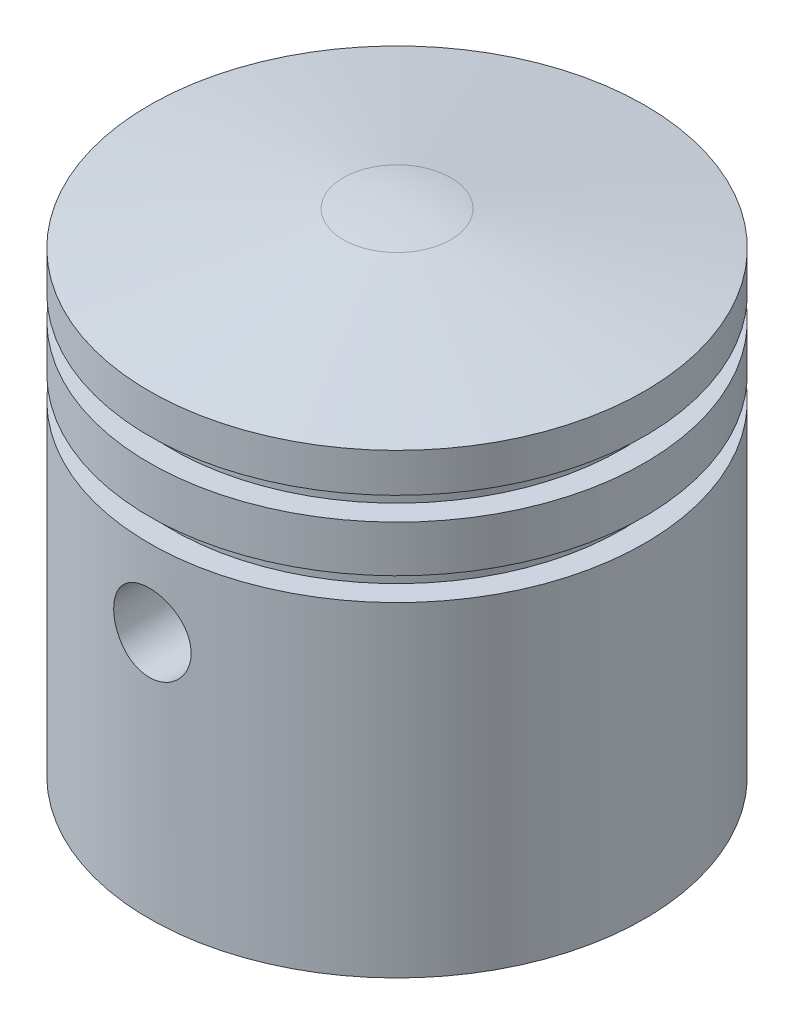
ISO-10303-21;
HEADER;
FILE_DESCRIPTION(('STEP AP214'),'2;1');
FILE_NAME('part.step','',(''),(''),'','','');
FILE_SCHEMA(('AUTOMOTIVE_DESIGN { 1 0 10303 214 1 1 1 1 }'));
ENDSEC;
DATA;
#1=APPLICATION_CONTEXT('core data for automotive mechanical design processes');
#2=APPLICATION_PROTOCOL_DEFINITION('international standard','automotive_design',2000,#1);
#3=PRODUCT_CONTEXT('',#1,'mechanical');
#4=PRODUCT('Part','Part','',(#3));
#5=PRODUCT_RELATED_PRODUCT_CATEGORY('part','',(#4));
#6=PRODUCT_DEFINITION_FORMATION('','',#4);
#7=PRODUCT_DEFINITION_CONTEXT('part definition',#1,'design');
#8=PRODUCT_DEFINITION('design','',#6,#7);
#9=PRODUCT_DEFINITION_SHAPE('','',#8);
#10=(LENGTH_UNIT() NAMED_UNIT(*) SI_UNIT(.MILLI.,.METRE.));
#11=(NAMED_UNIT(*) PLANE_ANGLE_UNIT() SI_UNIT($,.RADIAN.));
#12=(NAMED_UNIT(*) SI_UNIT($,.STERADIAN.) SOLID_ANGLE_UNIT());
#13=UNCERTAINTY_MEASURE_WITH_UNIT(LENGTH_MEASURE(1.E-05),#10,'distance_accuracy_value','');
#14=(GEOMETRIC_REPRESENTATION_CONTEXT(3) GLOBAL_UNCERTAINTY_ASSIGNED_CONTEXT((#13)) GLOBAL_UNIT_ASSIGNED_CONTEXT((#10,
#11,#12)) REPRESENTATION_CONTEXT('',''));
#15=CARTESIAN_POINT('',(0.,0.,0.));
#16=DIRECTION('',(0.,0.,1.));
#17=DIRECTION('',(1.,0.,0.));
#18=AXIS2_PLACEMENT_3D('',#15,#16,#17);
#19=CARTESIAN_POINT('',(0.,0.,0.));
#20=DIRECTION('',(0.,-1.,0.));
#21=DIRECTION('',(0.,0.,-1.));
#22=AXIS2_PLACEMENT_3D('',#19,#20,#21);
#23=CYLINDRICAL_SURFACE('',#22,16.);
#24=CARTESIAN_POINT('',(-2.5,16.,15.8034806292791));
#25=CARTESIAN_POINT('',(-2.49999429179104,16.139503378341,15.8034830346332));
#26=CARTESIAN_POINT('',(-2.48828377742084,16.2790859976853,15.8053478026579));
#27=CARTESIAN_POINT('',(-2.44176643645043,16.5543436290029,15.8125997089632));
#28=CARTESIAN_POINT('',(-2.40693752801736,16.6900147754794,15.8179902148259));
#29=CARTESIAN_POINT('',(-2.31525516047132,16.9534255896444,15.8316684916183));
#30=CARTESIAN_POINT('',(-2.25841914921921,17.0811714478708,15.8399539668268));
#31=CARTESIAN_POINT('',(-2.12437791816389,17.3252968908421,15.8584858981599));
#32=CARTESIAN_POINT('',(-2.04717531605122,17.4416779336595,15.8687321022281));
#33=CARTESIAN_POINT('',(-1.8738773011091,17.6607964851513,15.8901303851737));
#34=CARTESIAN_POINT('',(-1.77763988617499,17.7634210743996,15.9012888784461));
#35=CARTESIAN_POINT('',(-1.56931080987672,17.9511342204299,15.9231973082665));
#36=CARTESIAN_POINT('',(-1.45721825316848,18.0362217862243,15.9339472216983));
#37=CARTESIAN_POINT('',(-1.21963429185761,18.1868648770411,15.9538946715316));
#38=CARTESIAN_POINT('',(-1.09407592635729,18.2523160039745,15.9630838016344));
#39=CARTESIAN_POINT('',(-0.833580171794758,18.3611579547251,15.978803149105));
#40=CARTESIAN_POINT('',(-0.698643320136812,18.4045500413827,15.9853335186778));
#41=CARTESIAN_POINT('',(-0.424385325448813,18.4676987189562,15.9949542857973));
#42=CARTESIAN_POINT('',(-0.285108760160752,18.4876446490683,15.9980722260505));
#43=CARTESIAN_POINT('',(-0.00515314355067103,18.5039230433034,16.0006113098095));
#44=CARTESIAN_POINT('',(0.135525822989187,18.5002569263518,16.0000326754547));
#45=CARTESIAN_POINT('',(0.413000089722151,18.4695640737221,15.9952657389868));
#46=CARTESIAN_POINT('',(0.549818542575173,18.4427410611597,15.9911089169598));
#47=CARTESIAN_POINT('',(0.81698837534349,18.3668159713774,15.9796877395528));
#48=CARTESIAN_POINT('',(0.947339577352174,18.3177132816459,15.9724232987387));
#49=CARTESIAN_POINT('',(1.19848742679247,18.1984163441399,15.9555491842028));
#50=CARTESIAN_POINT('',(1.31924299071837,18.128136994572,15.9459300777042));
#51=CARTESIAN_POINT('',(1.54732385653213,17.9685439193708,15.9254174702046));
#52=CARTESIAN_POINT('',(1.65464819959324,17.879228836045,15.9145238783282));
#53=CARTESIAN_POINT('',(1.85402198520023,17.6829665129267,15.8925387825556));
#54=CARTESIAN_POINT('',(1.94589625613074,17.5758413336051,15.8814464071021));
#55=CARTESIAN_POINT('',(2.11039226047485,17.3476024353179,15.8604269384475));
#56=CARTESIAN_POINT('',(2.18301385538335,17.2264886157259,15.8504998536298));
#57=CARTESIAN_POINT('',(2.30697060635685,16.9735203718942,15.8329349281613));
#58=CARTESIAN_POINT('',(2.35828663884161,16.8416564249265,15.8252991458489));
#59=CARTESIAN_POINT('',(2.43799343127668,16.5710351512945,15.8132168990948));
#60=CARTESIAN_POINT('',(2.46638595195258,16.4322783549303,15.8087701897074));
#61=CARTESIAN_POINT('',(2.49919719237856,16.1533718967248,15.8036163696886));
#62=CARTESIAN_POINT('',(2.50386473411271,16.0132521998052,15.80287044806));
#63=CARTESIAN_POINT('',(2.48975479033184,15.7342323647021,15.8050994977182));
#64=CARTESIAN_POINT('',(2.47097809654328,15.5953321854941,15.8080743433524));
#65=CARTESIAN_POINT('',(2.41072412555895,15.3234721925335,15.8173740105186));
#66=CARTESIAN_POINT('',(2.36937178781979,15.1904840013604,15.8236803883335));
#67=CARTESIAN_POINT('',(2.26527072241932,14.9333260288961,15.8389172439685));
#68=CARTESIAN_POINT('',(2.20252085602949,14.809156717351,15.8478478614411));
#69=CARTESIAN_POINT('',(2.05681199170293,14.5720487183512,15.8674179220711));
#70=CARTESIAN_POINT('',(1.97369251093471,14.4592097711,15.8780706945976));
#71=CARTESIAN_POINT('',(1.78982593995283,14.2489930191518,15.8998450469621));
#72=CARTESIAN_POINT('',(1.6890777652142,14.151616166393,15.9109666556111));
#73=CARTESIAN_POINT('',(1.47171546765808,13.9741887293645,15.9325473887455));
#74=CARTESIAN_POINT('',(1.35496564158984,13.8943034235699,15.9429995842164));
#75=CARTESIAN_POINT('',(1.10955861029337,13.7552804800098,15.9619548934084));
#76=CARTESIAN_POINT('',(0.98090175316249,13.6961422359541,15.9704580640831));
#77=CARTESIAN_POINT('',(0.715839663778324,13.6005537247158,15.9845269767683));
#78=CARTESIAN_POINT('',(0.579467147617087,13.5640145025606,15.9901042225572));
#79=CARTESIAN_POINT('',(0.302427949770744,13.5143738673272,15.9977412978946));
#80=CARTESIAN_POINT('',(0.161761577654429,13.501270768644,15.9998013804089));
#81=CARTESIAN_POINT('',(-0.118272165188271,13.4989181473448,16.0001691012796));
#82=CARTESIAN_POINT('',(-0.257637428859786,13.5094162553572,15.9985164403994));
#83=CARTESIAN_POINT('',(-0.532594595464882,13.5534253161804,15.9917247801431));
#84=CARTESIAN_POINT('',(-0.668186513581642,13.5869361763784,15.9865857947973));
#85=CARTESIAN_POINT('',(-0.931668850429402,13.6759272597124,15.9733964142131));
#86=CARTESIAN_POINT('',(-1.05956579651625,13.7313885515809,15.965348528289));
#87=CARTESIAN_POINT('',(-1.30427807253219,13.862678838522,15.947223323121));
#88=CARTESIAN_POINT('',(-1.42109298145458,13.9385086069742,15.9371459268214));
#89=CARTESIAN_POINT('',(-1.64160219185804,14.1092894432084,15.9159528222148));
#90=CARTESIAN_POINT('',(-1.745151694824,14.204426314304,15.9048276353277));
#91=CARTESIAN_POINT('',(-1.93490712736947,14.4107299573354,15.8828612878644));
#92=CARTESIAN_POINT('',(-2.02110898563013,14.5219004817247,15.8720201944801));
#93=CARTESIAN_POINT('',(-2.17420151541622,14.7579211042754,15.8517779742959));
#94=CARTESIAN_POINT('',(-2.24097044145096,14.8828509586097,15.842386091806));
#95=CARTESIAN_POINT('',(-2.35247565604314,15.14224321763,15.8262143333515));
#96=CARTESIAN_POINT('',(-2.3972345005847,15.2766957011166,15.8194317848938));
#97=CARTESIAN_POINT('',(-2.45344906957713,15.5097697396964,15.8107909670081));
#98=CARTESIAN_POINT('',(-2.47087849275466,15.6069615999849,15.8080643798014));
#99=CARTESIAN_POINT('',(-2.49415589078728,15.8027557810464,15.804408373768));
#100=CARTESIAN_POINT('',(-2.50000403623692,15.9013580810218,15.8034789284691));
#101=CARTESIAN_POINT('',(-2.5,16.,15.8034806292791));
#102=B_SPLINE_CURVE_WITH_KNOTS('',3,(#24,#25,#26,#27,#28,#29,#30,#31,#32,#33,#34,#35,#36,#37,
#38,#39,#40,#41,#42,#43,#44,#45,#46,#47,#48,#49,#50,#51,#52,#53,#54,#55,#56,#57,#58,#59,#60,#61,
#62,#63,#64,#65,#66,#67,#68,#69,#70,#71,#72,#73,#74,#75,#76,#77,#78,#79,#80,#81,#82,#83,#84,#85,
#86,#87,#88,#89,#90,#91,#92,#93,#94,#95,#96,#97,#98,#99,#100,#101),.UNSPECIFIED.,.T.,.F.,(4,2,2,
2,2,2,2,2,2,2,2,2,2,2,2,2,2,2,2,2,2,2,2,2,2,2,2,2,2,2,2,2,2,2,2,2,2,2,4),(0.,0.418149527902243,
0.836699032574077,1.25491737645053,1.67308199345223,2.09449258051085,2.51592697424481,
2.93956378022295,3.36317633102573,3.78334397517517,4.20348637030326,4.61996979150785,
5.03646466334576,5.45465612930833,5.87287743207563,6.29556043395287,6.71824647655855,
7.14131110038651,7.56434322607051,7.98292940034458,8.40150143908464,8.81778013452042,
9.23408098683358,9.65377352836981,10.0734918986585,10.4970197199928,10.9205351635679,
11.3423727623224,11.7641800198745,12.18149834073,12.5988149821383,13.0157724881518,
13.432745828047,13.8539404040181,14.275233715164,14.6991122166338,15.1225554163993,
15.4182305458031,15.7139013198205),.UNSPECIFIED.);
#103=CARTESIAN_POINT('',(-2.5,16.,15.8034806292791));
#104=VERTEX_POINT('',#103);
#105=EDGE_CURVE('E82',#104,#104,#102,.T.);
#106=ORIENTED_EDGE('',*,*,#105,.T.);
#107=EDGE_LOOP('',(#106));
#108=FACE_BOUND('',#107,.T.);
#109=CARTESIAN_POINT('',(0.,21.,0.));
#110=DIRECTION('',(0.,-1.,0.));
#111=DIRECTION('',(0.,0.,-1.));
#112=AXIS2_PLACEMENT_3D('',#109,#110,#111);
#113=CIRCLE('',#112,16.);
#114=CARTESIAN_POINT('',(0.,21.,-16.));
#115=VERTEX_POINT('',#114);
#116=EDGE_CURVE('E51',#115,#115,#113,.T.);
#117=ORIENTED_EDGE('',*,*,#116,.T.);
#118=EDGE_LOOP('',(#117));
#119=FACE_BOUND('',#118,.T.);
#120=CARTESIAN_POINT('',(0.,0.,0.));
#121=DIRECTION('',(0.,-1.,0.));
#122=DIRECTION('',(0.,0.,-1.));
#123=AXIS2_PLACEMENT_3D('',#120,#121,#122);
#124=CIRCLE('',#123,16.);
#125=CARTESIAN_POINT('',(0.,0.,-16.));
#126=VERTEX_POINT('',#125);
#127=EDGE_CURVE('E10',#126,#126,#124,.T.);
#128=ORIENTED_EDGE('',*,*,#127,.F.);
#129=EDGE_LOOP('',(#128));
#130=FACE_BOUND('',#129,.T.);
#131=CARTESIAN_POINT('',(0.,18.5,-16.));
#132=CARTESIAN_POINT('',(-0.139515097271033,18.4999943017285,-15.9999977019448));
#133=CARTESIAN_POINT('',(-0.279109404865704,18.4882818862264,-15.9981561248574));
#134=CARTESIAN_POINT('',(-0.554391314978102,18.4417563087232,-15.9909869809759));
#135=CARTESIAN_POINT('',(-0.690075061323317,18.4069211074965,-15.9856560884472));
#136=CARTESIAN_POINT('',(-0.953512538047403,18.3152203371934,-15.9721069716578));
#137=CARTESIAN_POINT('',(-1.0812723522899,18.2583719186384,-15.9638909956317));
#138=CARTESIAN_POINT('',(-1.3254212510446,18.1243014548584,-15.9454779403815));
#139=CARTESIAN_POINT('',(-1.44181181036831,18.0470820569641,-15.9352811186255));
#140=CARTESIAN_POINT('',(-1.66091991165162,17.873766951646,-15.9139426841436));
#141=CARTESIAN_POINT('',(-1.76352747914264,17.7775330051098,-15.9027945139234));
#142=CARTESIAN_POINT('',(-1.95120768822823,17.5692180517311,-15.8808607613029));
#143=CARTESIAN_POINT('',(-2.03627928654192,17.4571361026998,-15.8700752005075));
#144=CARTESIAN_POINT('',(-2.18690544328884,17.2195617286563,-15.8500242812745));
#145=CARTESIAN_POINT('',(-2.25235273557991,17.0940005176382,-15.840767397861));
#146=CARTESIAN_POINT('',(-2.36118681597065,16.8334985891422,-15.8249120174236));
#147=CARTESIAN_POINT('',(-2.40457491010063,16.6985584274894,-15.8183133630222));
#148=CARTESIAN_POINT('',(-2.46771559322167,16.4242890988562,-15.8085863451104));
#149=CARTESIAN_POINT('',(-2.48765705487496,16.2850044141812,-15.8054302653236));
#150=CARTESIAN_POINT('',(-2.50392369757621,16.0050328111074,-15.8028617107177));
#151=CARTESIAN_POINT('',(-2.50025034860466,15.864345980534,-15.8034490028802));
#152=CARTESIAN_POINT('',(-2.4695458080889,15.5869029681473,-15.8082755045521));
#153=CARTESIAN_POINT('',(-2.44272562959693,15.4501227766469,-15.8124817218495));
#154=CARTESIAN_POINT('',(-2.36681937833751,15.1830279936407,-15.8240205634547));
#155=CARTESIAN_POINT('',(-2.31773262684132,15.0527135993595,-15.8313532830641));
#156=CARTESIAN_POINT('',(-2.19846916949384,14.8016112873228,-15.8483550685462));
#157=CARTESIAN_POINT('',(-2.12820372315549,14.6808662082269,-15.8580339308724));
#158=CARTESIAN_POINT('',(-1.96864058146637,14.4528004643145,-15.878630461501));
#159=CARTESIAN_POINT('',(-1.87934153253017,14.3454807551125,-15.8895482178821));
#160=CARTESIAN_POINT('',(-1.68309088822333,14.1460897533667,-15.911537862489));
#161=CARTESIAN_POINT('',(-1.57595800560539,14.0541968417305,-15.9226101363559));
#162=CARTESIAN_POINT('',(-1.34769694737936,13.8896668543601,-15.9435512534783));
#163=CARTESIAN_POINT('',(-1.22656870068132,13.8170298764432,-15.9534200906202));
#164=CARTESIAN_POINT('',(-0.973595927056492,13.6930619265776,-15.9708539902704));
#165=CARTESIAN_POINT('',(-0.841744186240461,13.641745441467,-15.9784174854193));
#166=CARTESIAN_POINT('',(-0.57114953469676,13.5620340325528,-15.9903756000068));
#167=CARTESIAN_POINT('',(-0.432407130687201,13.5336374259335,-15.9947704520898));
#168=CARTESIAN_POINT('',(-0.153508336763736,13.5008107235498,-15.9998651172728));
#169=CARTESIAN_POINT('',(-0.0133814615087031,13.4961355210238,-16.0006027179286));
#170=CARTESIAN_POINT('',(0.265654546411641,13.510232705336,-15.9984028649127));
#171=CARTESIAN_POINT('',(0.404563719925155,13.5290043025891,-15.9954655349964));
#172=CARTESIAN_POINT('',(0.676473446265704,13.5892583876802,-15.9862692369322));
#173=CARTESIAN_POINT('',(0.809501262056041,13.6306207582677,-15.9800278421539));
#174=CARTESIAN_POINT('',(1.06673406785663,13.7347550943988,-15.9649207568356));
#175=CARTESIAN_POINT('',(1.19093861303941,13.7975281384427,-15.9560549341007));
#176=CARTESIAN_POINT('',(1.42807220225041,13.9432719911266,-15.9365897274094));
#177=CARTESIAN_POINT('',(1.54090512378373,14.0263974200905,-15.9259772866342));
#178=CARTESIAN_POINT('',(1.75110696507806,14.2102720859078,-15.9042388046444));
#179=CARTESIAN_POINT('',(1.84847490447018,14.3110224392049,-15.8931127309268));
#180=CARTESIAN_POINT('',(2.02588080776691,14.5283811972172,-15.8714802753665));
#181=CARTESIAN_POINT('',(2.10575398584126,14.6451248471223,-15.860980411908));
#182=CARTESIAN_POINT('',(2.2447556772664,14.8905160736613,-15.8419069280583));
#183=CARTESIAN_POINT('',(2.30388478778105,15.0191633074895,-15.83333325222));
#184=CARTESIAN_POINT('',(2.39946771944995,15.2842296407142,-15.8191307135236));
#185=CARTESIAN_POINT('',(2.43600654947912,15.4206174687656,-15.8134908234896));
#186=CARTESIAN_POINT('',(2.48564122040535,15.697689143664,-15.8057657028079));
#187=CARTESIAN_POINT('',(2.49873883084997,15.838372665419,-15.8036802038444));
#188=CARTESIAN_POINT('',(2.50107452690756,16.1183987159075,-15.8033105804488));
#189=CARTESIAN_POINT('',(2.49057180548425,16.2577390969335,-15.804985160429));
#190=CARTESIAN_POINT('',(2.44656223255901,16.5326452971443,-15.8118569894183));
#191=CARTESIAN_POINT('',(2.41305543086961,16.6682111245017,-15.8170542307995));
#192=CARTESIAN_POINT('',(2.32408329891851,16.9316378266405,-15.8303708885491));
#193=CARTESIAN_POINT('',(2.26863761738581,17.0595054782584,-15.8384876895341));
#194=CARTESIAN_POINT('',(2.13738768546417,17.3041656136763,-15.856731840474));
#195=CARTESIAN_POINT('',(2.06158262820886,17.4209576582884,-15.8668592701083));
#196=CARTESIAN_POINT('',(1.8908300813908,17.6414655441268,-15.8881156809226));
#197=CARTESIAN_POINT('',(1.79569107094768,17.7450321966138,-15.8992540116029));
#198=CARTESIAN_POINT('',(1.58937594638204,17.9348212363867,-15.9212004364073));
#199=CARTESIAN_POINT('',(1.47819612078433,18.0210395985919,-15.9320084534012));
#200=CARTESIAN_POINT('',(1.24216685884342,18.1741512230316,-15.952151024567));
#201=CARTESIAN_POINT('',(1.11723937214238,18.2409253727596,-15.9614763443027));
#202=CARTESIAN_POINT('',(0.857851882357786,18.3524409961929,-15.9775125983888));
#203=CARTESIAN_POINT('',(0.723401776581764,18.3972049725584,-15.9842262014212));
#204=CARTESIAN_POINT('',(0.490314239911595,18.4534330210906,-15.9927744586488));
#205=CARTESIAN_POINT('',(0.393105575651625,18.470868490629,-15.9954699162612));
#206=CARTESIAN_POINT('',(0.197277797850582,18.4941539133791,-15.9990834869762));
#207=CARTESIAN_POINT('',(0.0986587041691185,18.5000040295573,-16.0000016250796));
#208=CARTESIAN_POINT('',(0.,18.5,-16.));
#209=B_SPLINE_CURVE_WITH_KNOTS('',3,(#131,#132,#133,#134,#135,#136,#137,#138,#139,#140,#141,
#142,#143,#144,#145,#146,#147,#148,#149,#150,#151,#152,#153,#154,#155,#156,#157,#158,#159,#160,
#161,#162,#163,#164,#165,#166,#167,#168,#169,#170,#171,#172,#173,#174,#175,#176,#177,#178,#179,
#180,#181,#182,#183,#184,#185,#186,#187,#188,#189,#190,#191,#192,#193,#194,#195,#196,#197,#198,
#199,#200,#201,#202,#203,#204,#205,#206,#207,#208),.UNSPECIFIED.,.T.,.F.,(4,2,2,2,2,2,2,2,2,2,2,
2,2,2,2,2,2,2,2,2,2,2,2,2,2,2,2,2,2,2,2,2,2,2,2,2,2,2,4),(0.,0.418184740477491,
0.836768642528014,1.25502707944103,1.6732311879203,2.09459568152199,2.51598523645422,
2.93963778605759,3.36326525009238,3.78345631134995,4.20362121670545,4.6199957602258,
5.0363829965105,5.45453977402347,5.87272629892068,6.29545732334367,6.71819049513827,
7.14121043754564,7.56419931829866,7.98280854005914,8.40140366528356,8.81779444756566,
9.23420620742031,9.65388541469671,10.0735912160142,10.4970948024959,10.9205861964898,
11.3424741039513,11.764330162293,12.1815758159869,12.598820566189,13.0156924696662,
13.4325808967135,13.8538201231554,14.275156971423,14.6990230419984,15.1224548565628,
15.4181801635154,15.7139013105871),.UNSPECIFIED.);
#210=CARTESIAN_POINT('',(0.,18.5,-16.));
#211=VERTEX_POINT('',#210);
#212=EDGE_CURVE('E88',#211,#211,#209,.T.);
#213=ORIENTED_EDGE('',*,*,#212,.T.);
#214=EDGE_LOOP('',(#213));
#215=FACE_BOUND('',#214,.T.);
#216=ADVANCED_FACE('F37',(#108,#119,#130,#215),#23,.T.);
#217=CARTESIAN_POINT('',(0.,0.,0.));
#218=DIRECTION('',(0.,-1.,0.));
#219=DIRECTION('',(0.,0.,-1.));
#220=AXIS2_PLACEMENT_3D('',#217,#218,#219);
#221=CYLINDRICAL_SURFACE('',#220,10.);
#222=CARTESIAN_POINT('',(-2.5,16.,9.68245836551854));
#223=CARTESIAN_POINT('',(-2.49999607859307,15.8619492490734,9.6824610008786));
#224=CARTESIAN_POINT('',(-2.48852624549765,15.7238551013215,9.68544306014597));
#225=CARTESIAN_POINT('',(-2.44302312546379,15.4516324218265,9.69701861992564));
#226=CARTESIAN_POINT('',(-2.4089767067421,15.3175062455318,9.7056153862163));
#227=CARTESIAN_POINT('',(-2.31949119963204,15.0571964618128,9.7273872459615));
#228=CARTESIAN_POINT('',(-2.26407972785449,14.9310028446143,9.74055642690458));
#229=CARTESIAN_POINT('',(-2.13352114126138,14.6896891474601,9.76998192028759));
#230=CARTESIAN_POINT('',(-2.05837318856068,14.5745695379198,9.78623836378489));
#231=CARTESIAN_POINT('',(-1.88870842731188,14.3561383547378,9.82040716355625));
#232=CARTESIAN_POINT('',(-1.79383688770405,14.25310639965,9.83834597623034));
#233=CARTESIAN_POINT('',(-1.58818206410066,14.0642386056397,9.87362875515294));
#234=CARTESIAN_POINT('',(-1.47739729418031,13.9784043743783,9.89097266566388));
#235=CARTESIAN_POINT('',(-1.24114520107895,13.8252245323687,9.92340415520582));
#236=CARTESIAN_POINT('',(-1.11549457619512,13.7581536118385,9.93845687400592));
#237=CARTESIAN_POINT('',(-0.854263184292762,13.6461903558469,9.96430811925984));
#238=CARTESIAN_POINT('',(-0.71868388579194,13.6012947480845,9.97510727334345));
#239=CARTESIAN_POINT('',(-0.444358758754162,13.5358521654214,9.9910475884818));
#240=CARTESIAN_POINT('',(-0.305732719548975,13.5148303556734,9.99629893844314));
#241=CARTESIAN_POINT('',(-0.0268288192627693,13.4962416207244,10.000935941073));
#242=CARTESIAN_POINT('',(0.113448794538069,13.4986712277904,10.000322460967));
#243=CARTESIAN_POINT('',(0.388380617930968,13.5265748502501,9.99338094953534));
#244=CARTESIAN_POINT('',(0.523090539002668,13.5515363250539,9.98718002340871));
#245=CARTESIAN_POINT('',(0.786345618534216,13.6229712700485,9.96990836524857));
#246=CARTESIAN_POINT('',(0.914890448426095,13.6694458853774,9.95883737398452));
#247=CARTESIAN_POINT('',(1.16351675875452,13.7830025706871,9.93287509700884));
#248=CARTESIAN_POINT('',(1.28351127441626,13.8502670446617,9.91795019695011));
#249=CARTESIAN_POINT('',(1.51068905585122,14.0033556791163,9.88589903809692));
#250=CARTESIAN_POINT('',(1.61787008771377,14.0891830685606,9.8687723965265));
#251=CARTESIAN_POINT('',(1.81943508771239,14.2797087419824,9.83363713769356));
#252=CARTESIAN_POINT('',(1.91339419768799,14.3848548923477,9.81561719525297));
#253=CARTESIAN_POINT('',(2.08244093990755,14.6095999735403,9.78115043517327));
#254=CARTESIAN_POINT('',(2.15752769011507,14.7291995794911,9.76470369108289));
#255=CARTESIAN_POINT('',(2.28697032255647,14.9802900341489,9.73520496829319));
#256=CARTESIAN_POINT('',(2.34122391742612,15.1118357303128,9.72216983717007));
#257=CARTESIAN_POINT('',(2.42671405159095,15.3825854680768,9.70118640148669));
#258=CARTESIAN_POINT('',(2.45795551638266,15.5217878639846,9.69323700842733));
#259=CARTESIAN_POINT('',(2.49582963866592,15.7999595015299,9.68355356007457));
#260=CARTESIAN_POINT('',(2.50309047391912,15.938837793341,9.68166088976933));
#261=CARTESIAN_POINT('',(2.49451699051516,16.2158219365853,9.68387343364692));
#262=CARTESIAN_POINT('',(2.4786847978498,16.3539278579494,9.687978095703));
#263=CARTESIAN_POINT('',(2.42492546393825,16.6231142649486,9.7015708198498));
#264=CARTESIAN_POINT('',(2.3873640682819,16.7542727265692,9.71096970242532));
#265=CARTESIAN_POINT('',(2.29161808167046,17.0084314578533,9.73400718262805));
#266=CARTESIAN_POINT('',(2.2334310477125,17.1314307590558,9.74764628246408));
#267=CARTESIAN_POINT('',(2.0967706679366,17.3684412778669,9.77796137095511));
#268=CARTESIAN_POINT('',(2.01792175383564,17.482228840043,9.79469168607245));
#269=CARTESIAN_POINT('',(1.84265073233613,17.6951883628015,9.82917083071113));
#270=CARTESIAN_POINT('',(1.7462257370136,17.7943579166501,9.84691982728307));
#271=CARTESIAN_POINT('',(1.53565680246182,17.9778110425709,9.88197403031774));
#272=CARTESIAN_POINT('',(1.42112988132898,18.0616600625488,9.8992570206188));
#273=CARTESIAN_POINT('',(1.17925670673669,18.2089358669513,9.93097216613689));
#274=CARTESIAN_POINT('',(1.05191112239398,18.2723637166082,9.94540447003949));
#275=CARTESIAN_POINT('',(0.788895504327728,18.3764460345279,9.96970115738325));
#276=CARTESIAN_POINT('',(0.653293452569706,18.4172642843791,9.97959830022409));
#277=CARTESIAN_POINT('',(0.376874400797018,18.4754603346084,9.99385293395789));
#278=CARTESIAN_POINT('',(0.236058412603101,18.492842658739,9.99821149393422));
#279=CARTESIAN_POINT('',(-0.0427088161083079,18.5034189739388,10.0008542352202));
#280=CARTESIAN_POINT('',(-0.180634567415054,18.4972542727385,9.99929947199971));
#281=CARTESIAN_POINT('',(-0.453418741036877,18.4623804317641,9.99064741143608));
#282=CARTESIAN_POINT('',(-0.588277254452321,18.4336719624671,9.98355027892922));
#283=CARTESIAN_POINT('',(-0.850427589111935,18.3548694505728,9.96463582134723));
#284=CARTESIAN_POINT('',(-0.977756236452158,18.3048913667141,9.95284411255981));
#285=CARTESIAN_POINT('',(-1.22229263260406,18.1850735524511,9.92578222284145));
#286=CARTESIAN_POINT('',(-1.33949910316408,18.1152313183238,9.91051160346894));
#287=CARTESIAN_POINT('',(-1.56350482105826,17.9557119150097,9.87768124200718));
#288=CARTESIAN_POINT('',(-1.66998747074584,17.8655996427404,9.86007542354161));
#289=CARTESIAN_POINT('',(-1.86653755068376,17.6689428700566,9.82476622642974));
#290=CARTESIAN_POINT('',(-1.95660081269148,17.5623942097221,9.80706282418256));
#291=CARTESIAN_POINT('',(-2.11940506617958,17.3334964645263,9.77318689613756));
#292=CARTESIAN_POINT('',(-2.19179154854095,17.2108896915869,9.75704909183222));
#293=CARTESIAN_POINT('',(-2.31481724146367,16.954861275313,9.7285988873707));
#294=CARTESIAN_POINT('',(-2.36547227438038,16.8214475847654,9.71628370583034));
#295=CARTESIAN_POINT('',(-2.43605632142751,16.5735574704121,9.69879771876843));
#296=CARTESIAN_POINT('',(-2.4599829264922,16.4602670890347,9.69271657508747));
#297=CARTESIAN_POINT('',(-2.49195573142942,16.2313278275058,9.6845459645655));
#298=CARTESIAN_POINT('',(-2.50000328592938,16.115679149389,9.68245615722769));
#299=CARTESIAN_POINT('',(-2.5,16.,9.68245836551854));
#300=B_SPLINE_CURVE_WITH_KNOTS('',3,(#222,#223,#224,#225,#226,#227,#228,#229,#230,#231,#232,
#233,#234,#235,#236,#237,#238,#239,#240,#241,#242,#243,#244,#245,#246,#247,#248,#249,#250,#251,
#252,#253,#254,#255,#256,#257,#258,#259,#260,#261,#262,#263,#264,#265,#266,#267,#268,#269,#270,
#271,#272,#273,#274,#275,#276,#277,#278,#279,#280,#281,#282,#283,#284,#285,#286,#287,#288,#289,
#290,#291,#292,#293,#294,#295,#296,#297,#298,#299),.UNSPECIFIED.,.T.,.F.,(4,2,2,2,2,2,2,2,2,2,2,
2,2,2,2,2,2,2,2,2,2,2,2,2,2,2,2,2,2,2,2,2,2,2,2,2,2,2,4),(0.,0.413727441736135,
0.827695741428666,1.24113072716602,1.65458326755479,2.07623954192976,2.49793521479867,
2.9255149639792,3.35303159847092,3.77188750995346,4.1906814866602,4.60018262688947,
5.00970556724786,5.42292874254445,5.83622385468913,6.26070466571912,6.68520531199802,
7.11176432008403,7.53823200129548,7.95343574764204,8.36860127188747,8.77697405014152,
9.18539521426363,9.60182845864102,10.0183301888999,10.4452533097026,10.872154157245,
11.2959207281187,11.7196054891398,12.131834461324,12.5440511738193,12.9540487656466,
13.3640980574302,13.7839709658702,14.2039503157045,14.6317647729113,15.0592672137501,
15.4059782718573,15.7526597510792),.UNSPECIFIED.);
#301=CARTESIAN_POINT('',(-2.5,16.,9.68245836551854));
#302=VERTEX_POINT('',#301);
#303=EDGE_CURVE('E60',#302,#302,#300,.T.);
#304=ORIENTED_EDGE('',*,*,#303,.T.);
#305=EDGE_LOOP('',(#304));
#306=FACE_BOUND('',#305,.T.);
#307=CARTESIAN_POINT('',(0.,10.,0.));
#308=DIRECTION('',(0.,-1.,0.));
#309=DIRECTION('',(0.,0.,-1.));
#310=AXIS2_PLACEMENT_3D('',#307,#308,#309);
#311=CIRCLE('',#310,10.);
#312=CARTESIAN_POINT('',(0.,10.,-10.));
#313=VERTEX_POINT('',#312);
#314=EDGE_CURVE('E151',#313,#313,#311,.T.);
#315=ORIENTED_EDGE('',*,*,#314,.T.);
#316=EDGE_LOOP('',(#315));
#317=FACE_BOUND('',#316,.T.);
#318=CARTESIAN_POINT('',(0.,24.,0.));
#319=DIRECTION('',(0.,-1.,0.));
#320=DIRECTION('',(0.,0.,-1.));
#321=AXIS2_PLACEMENT_3D('',#318,#319,#320);
#322=CIRCLE('',#321,10.);
#323=CARTESIAN_POINT('',(0.,24.,-10.));
#324=VERTEX_POINT('',#323);
#325=EDGE_CURVE('E147',#324,#324,#322,.T.);
#326=ORIENTED_EDGE('',*,*,#325,.F.);
#327=EDGE_LOOP('',(#326));
#328=FACE_BOUND('',#327,.T.);
#329=CARTESIAN_POINT('',(0.,18.5,-10.));
#330=CARTESIAN_POINT('',(0.138126814449552,18.4999961237697,-9.99999766446687));
#331=CARTESIAN_POINT('',(0.276296929717938,18.4885140820437,-9.99710963553044));
#332=CARTESIAN_POINT('',(0.548677206284221,18.442958081155,-9.98586856383157));
#333=CARTESIAN_POINT('',(0.682885078117899,18.4088713174369,-9.97751242366627));
#334=CARTESIAN_POINT('',(0.943368120304295,18.3192679108965,-9.9562604388672));
#335=CARTESIAN_POINT('',(1.06965260571667,18.2637770021412,-9.94337004736764));
#336=CARTESIAN_POINT('',(1.31112021984071,18.1330310165919,-9.91442239679369));
#337=CARTESIAN_POINT('',(1.42630297391461,18.0577752731351,-9.89836503090261));
#338=CARTESIAN_POINT('',(1.64466987883486,17.8879986839097,-9.86445689319489));
#339=CARTESIAN_POINT('',(1.74759281676843,17.7931473750682,-9.84657845246877));
#340=CARTESIAN_POINT('',(1.93624821200553,17.5875796584849,-9.8112270019656));
#341=CARTESIAN_POINT('',(2.02197872824865,17.4768614617551,-9.79375403816446));
#342=CARTESIAN_POINT('',(2.17504423799829,17.240674622105,-9.76091292830281));
#343=CARTESIAN_POINT('',(2.2420870265419,17.1150112819855,-9.74557990774685));
#344=CARTESIAN_POINT('',(2.35399484758457,16.8537526472333,-9.71915824696694));
#345=CARTESIAN_POINT('',(2.39886342573357,16.7181589444466,-9.70806892824031));
#346=CARTESIAN_POINT('',(2.46425806134127,16.4437608363306,-9.69167461160538));
#347=CARTESIAN_POINT('',(2.48525378055342,16.30507517327,-9.68625818328352));
#348=CARTESIAN_POINT('',(2.50376962511068,16.0260523850011,-9.68148937432652));
#349=CARTESIAN_POINT('',(2.50129356969685,15.8857155321798,-9.68213600713214));
#350=CARTESIAN_POINT('',(2.47331087439951,15.6109736537577,-9.68932009194695));
#351=CARTESIAN_POINT('',(2.44836390031772,15.4765072975578,-9.69571438345489));
#352=CARTESIAN_POINT('',(2.37704031150499,15.2137315818149,-9.71344516118448));
#353=CARTESIAN_POINT('',(2.33066217011565,15.0854226616185,-9.72478199948731));
#354=CARTESIAN_POINT('',(2.21731579656197,14.8371033062465,-9.75125189842765));
#355=CARTESIAN_POINT('',(2.1501444453882,14.717189713684,-9.76642212449693));
#356=CARTESIAN_POINT('',(1.99726046002491,14.4901354837386,-9.79882851409985));
#357=CARTESIAN_POINT('',(1.91154458134806,14.3829970865546,-9.81606503891047));
#358=CARTESIAN_POINT('',(1.72110570780203,14.181327307176,-9.85126467566485));
#359=CARTESIAN_POINT('',(1.61591043027643,14.0872425165644,-9.86923449130001));
#360=CARTESIAN_POINT('',(1.39101986250617,13.9179645958935,-9.90343275964594));
#361=CARTESIAN_POINT('',(1.27132412951324,13.8427720428941,-9.91966115915679));
#362=CARTESIAN_POINT('',(1.02019314780232,13.7132490229594,-9.94862886823651));
#363=CARTESIAN_POINT('',(0.88871898868104,13.658991099576,-9.96135600212879));
#364=CARTESIAN_POINT('',(0.618126680238139,13.5734711571507,-9.98179861652361));
#365=CARTESIAN_POINT('',(0.479009998584142,13.5422047393031,-9.98951505565468));
#366=CARTESIAN_POINT('',(0.200899950650045,13.5042373907353,-9.99892498785624));
#367=CARTESIAN_POINT('',(0.061994533313684,13.4969282898745,-10.0007675584713));
#368=CARTESIAN_POINT('',(-0.215054791335847,13.5054150034258,-9.99864674690754));
#369=CARTESIAN_POINT('',(-0.353198766074326,13.5212087379986,-9.99468388736421));
#370=CARTESIAN_POINT('',(-0.622690447960816,13.5749515139856,-9.98149301878918));
#371=CARTESIAN_POINT('',(-0.754108531614582,13.6125687724616,-9.97234390309647));
#372=CARTESIAN_POINT('',(-1.00876215408753,13.7085118067141,-9.94981177723595));
#373=CARTESIAN_POINT('',(-1.13199686505442,13.7668396738554,-9.93642833949965));
#374=CARTESIAN_POINT('',(-1.36920522404972,13.9037268814578,-9.9065551321037));
#375=CARTESIAN_POINT('',(-1.48297573639294,13.9826268539943,-9.89001445610999));
#376=CARTESIAN_POINT('',(-1.69587768940552,14.1579831813286,-9.85574181979586));
#377=CARTESIAN_POINT('',(-1.79500659828875,14.2544425660294,-9.83800965421578));
#378=CARTESIAN_POINT('',(-1.97831761345414,14.4650032680728,-9.80281594932498));
#379=CARTESIAN_POINT('',(-2.06207311270184,14.5794795049993,-9.78537173637463));
#380=CARTESIAN_POINT('',(-2.20918459835604,14.8212210574476,-9.75321463970069));
#381=CARTESIAN_POINT('',(-2.27254149026901,14.9484858049507,-9.73850163474941));
#382=CARTESIAN_POINT('',(-2.37658570101223,15.2115095373437,-9.71363491194665));
#383=CARTESIAN_POINT('',(-2.41740732773931,15.3472127138538,-9.70345425375809));
#384=CARTESIAN_POINT('',(-2.47557609990489,15.6238493964255,-9.68877906706586));
#385=CARTESIAN_POINT('',(-2.49292837912652,15.7647817517024,-9.68428329504044));
#386=CARTESIAN_POINT('',(-2.50339765056083,16.0435350397694,-9.68158168701612));
#387=CARTESIAN_POINT('',(-2.49719649630131,16.1813290585441,-9.68319887888034));
#388=CARTESIAN_POINT('',(-2.46229546385366,16.4538398144438,-9.69213181672143));
#389=CARTESIAN_POINT('',(-2.43359603781098,16.5885566133553,-9.69944744817732));
#390=CARTESIAN_POINT('',(-2.35488553240495,16.8503474317764,-9.71885434473222));
#391=CARTESIAN_POINT('',(-2.30500234113404,16.9774621754006,-9.73091692061057));
#392=CARTESIAN_POINT('',(-2.18544152267504,17.2216089711893,-9.7584625954084));
#393=CARTESIAN_POINT('',(-2.11576115005696,17.3386396219781,-9.77394616867808));
#394=CARTESIAN_POINT('',(-1.95644624772858,17.5625910483368,-9.80709390439337));
#395=CARTESIAN_POINT('',(-1.86633860485376,17.6691684557066,-9.82480441386302));
#396=CARTESIAN_POINT('',(-1.66964895198288,17.8659117413257,-9.86013378743769));
#397=CARTESIAN_POINT('',(-1.56306303543524,17.9560737168549,-9.87775262878422));
#398=CARTESIAN_POINT('',(-1.33411264450432,18.1190188476077,-9.9112942607945));
#399=CARTESIAN_POINT('',(-1.21149737052731,18.1914576894526,-9.92718055609783));
#400=CARTESIAN_POINT('',(-0.955443432517459,18.3145791049009,-9.95508208291861));
#401=CARTESIAN_POINT('',(-0.8220126057279,18.3652772677476,-9.96710008666302));
#402=CARTESIAN_POINT('',(-0.574017088739121,18.4359530505494,-9.98413432609236));
#403=CARTESIAN_POINT('',(-0.460633618180115,18.4599187384224,-9.99004308421151));
#404=CARTESIAN_POINT('',(-0.231510119227139,18.4919432393699,-9.9979767538658));
#405=CARTESIAN_POINT('',(-0.115770268737694,18.5000032488422,-10.0000019575149));
#406=CARTESIAN_POINT('',(0.,18.5,-10.));
#407=B_SPLINE_CURVE_WITH_KNOTS('',3,(#329,#330,#331,#332,#333,#334,#335,#336,#337,#338,#339,
#340,#341,#342,#343,#344,#345,#346,#347,#348,#349,#350,#351,#352,#353,#354,#355,#356,#357,#358,
#359,#360,#361,#362,#363,#364,#365,#366,#367,#368,#369,#370,#371,#372,#373,#374,#375,#376,#377,
#378,#379,#380,#381,#382,#383,#384,#385,#386,#387,#388,#389,#390,#391,#392,#393,#394,#395,#396,
#397,#398,#399,#400,#401,#402,#403,#404,#405,#406),.UNSPECIFIED.,.T.,.F.,(4,2,2,2,2,2,2,2,2,2,2,
2,2,2,2,2,2,2,2,2,2,2,2,2,2,2,2,2,2,2,2,2,2,2,2,2,2,2,4),(0.,0.41395618745315,0.828147062939832,
1.24184150381018,1.65554990028221,2.07690725728565,2.4983121596677,2.92597745909678,
3.35357435282281,3.77260491835117,4.19156730193363,4.60037495017231,5.00921172448932,
5.42217546462,5.83521151399139,6.26002501620567,6.6848514926928,7.11113715020724,
7.53734122819939,7.95263848254328,8.36789835193439,8.7770045752893,9.18615212209352,
9.60255979281121,10.0190393835223,10.4457418201299,10.8724253125471,11.2965375769764,
11.7205570543048,12.1323963400748,12.5442273493652,12.9536066760888,13.3630428023797,
13.7831596069298,14.2033761629383,14.6312030917578,15.0587227304538,15.4057040491338,
15.752659267482),.UNSPECIFIED.);
#408=CARTESIAN_POINT('',(0.,18.5,-10.));
#409=VERTEX_POINT('',#408);
#410=EDGE_CURVE('E41',#409,#409,#407,.T.);
#411=ORIENTED_EDGE('',*,*,#410,.T.);
#412=EDGE_LOOP('',(#411));
#413=FACE_BOUND('',#412,.T.);
#414=ADVANCED_FACE('F66',(#306,#317,#328,#413),#221,.F.);
#415=CARTESIAN_POINT('',(13.,0.,0.));
#416=DIRECTION('',(0.,-1.,0.));
#417=DIRECTION('',(0.,0.,-1.));
#418=AXIS2_PLACEMENT_3D('',#415,#416,#417);
#419=PLANE('',#418);
#420=ORIENTED_EDGE('',*,*,#127,.T.);
#421=EDGE_LOOP('',(#420));
#422=FACE_BOUND('',#421,.T.);
#423=CARTESIAN_POINT('',(0.,0.,0.));
#424=DIRECTION('',(0.,-1.,0.));
#425=DIRECTION('',(0.,0.,-1.));
#426=AXIS2_PLACEMENT_3D('',#423,#424,#425);
#427=CIRCLE('',#426,13.);
#428=CARTESIAN_POINT('',(0.,0.,-13.));
#429=VERTEX_POINT('',#428);
#430=EDGE_CURVE('E202',#429,#429,#427,.T.);
#431=ORIENTED_EDGE('',*,*,#430,.F.);
#432=EDGE_LOOP('',(#431));
#433=FACE_BOUND('',#432,.T.);
#434=ADVANCED_FACE('F39',(#422,#433),#419,.T.);
#435=CARTESIAN_POINT('',(14.5,21.,0.));
#436=DIRECTION('',(0.,1.,0.));
#437=DIRECTION('',(0.,0.,1.));
#438=AXIS2_PLACEMENT_3D('',#435,#436,#437);
#439=PLANE('',#438);
#440=CARTESIAN_POINT('',(0.,21.,0.));
#441=DIRECTION('',(0.,-1.,0.));
#442=DIRECTION('',(0.,0.,-1.));
#443=AXIS2_PLACEMENT_3D('',#440,#441,#442);
#444=CIRCLE('',#443,14.5);
#445=CARTESIAN_POINT('',(0.,21.,-14.5));
#446=VERTEX_POINT('',#445);
#447=EDGE_CURVE('E57',#446,#446,#444,.T.);
#448=ORIENTED_EDGE('',*,*,#447,.T.);
#449=EDGE_LOOP('',(#448));
#450=FACE_BOUND('',#449,.T.);
#451=ORIENTED_EDGE('',*,*,#116,.F.);
#452=EDGE_LOOP('',(#451));
#453=FACE_BOUND('',#452,.T.);
#454=ADVANCED_FACE('F97',(#450,#453),#439,.T.);
#455=CARTESIAN_POINT('',(0.,0.,0.));
#456=DIRECTION('',(0.,-1.,0.));
#457=DIRECTION('',(0.,0.,-1.));
#458=AXIS2_PLACEMENT_3D('',#455,#456,#457);
#459=CYLINDRICAL_SURFACE('',#458,14.5);
#460=CARTESIAN_POINT('',(0.,22.5,0.));
#461=DIRECTION('',(0.,-1.,0.));
#462=DIRECTION('',(0.,0.,-1.));
#463=AXIS2_PLACEMENT_3D('',#460,#461,#462);
#464=CIRCLE('',#463,14.5);
#465=CARTESIAN_POINT('',(0.,22.5,-14.5));
#466=VERTEX_POINT('',#465);
#467=EDGE_CURVE('E186',#466,#466,#464,.T.);
#468=ORIENTED_EDGE('',*,*,#467,.T.);
#469=EDGE_LOOP('',(#468));
#470=FACE_BOUND('',#469,.T.);
#471=ORIENTED_EDGE('',*,*,#447,.F.);
#472=EDGE_LOOP('',(#471));
#473=FACE_BOUND('',#472,.T.);
#474=ADVANCED_FACE('F101',(#470,#473),#459,.T.);
#475=CARTESIAN_POINT('',(16.,22.5,0.));
#476=DIRECTION('',(0.,-1.,0.));
#477=DIRECTION('',(0.,0.,-1.));
#478=AXIS2_PLACEMENT_3D('',#475,#476,#477);
#479=PLANE('',#478);
#480=CARTESIAN_POINT('',(0.,22.5,0.));
#481=DIRECTION('',(0.,-1.,0.));
#482=DIRECTION('',(0.,0.,-1.));
#483=AXIS2_PLACEMENT_3D('',#480,#481,#482);
#484=CIRCLE('',#483,16.);
#485=CARTESIAN_POINT('',(0.,22.5,-16.));
#486=VERTEX_POINT('',#485);
#487=EDGE_CURVE('E182',#486,#486,#484,.T.);
#488=ORIENTED_EDGE('',*,*,#487,.T.);
#489=EDGE_LOOP('',(#488));
#490=FACE_BOUND('',#489,.T.);
#491=ORIENTED_EDGE('',*,*,#467,.F.);
#492=EDGE_LOOP('',(#491));
#493=FACE_BOUND('',#492,.T.);
#494=ADVANCED_FACE('F105',(#490,#493),#479,.T.);
#495=CARTESIAN_POINT('',(0.,0.,0.));
#496=DIRECTION('',(0.,-1.,0.));
#497=DIRECTION('',(0.,0.,-1.));
#498=AXIS2_PLACEMENT_3D('',#495,#496,#497);
#499=CYLINDRICAL_SURFACE('',#498,16.);
#500=CARTESIAN_POINT('',(0.,25.5,0.));
#501=DIRECTION('',(0.,-1.,0.));
#502=DIRECTION('',(0.,0.,-1.));
#503=AXIS2_PLACEMENT_3D('',#500,#501,#502);
#504=CIRCLE('',#503,16.);
#505=CARTESIAN_POINT('',(0.,25.5,-16.));
#506=VERTEX_POINT('',#505);
#507=EDGE_CURVE('E178',#506,#506,#504,.T.);
#508=ORIENTED_EDGE('',*,*,#507,.T.);
#509=EDGE_LOOP('',(#508));
#510=FACE_BOUND('',#509,.T.);
#511=ORIENTED_EDGE('',*,*,#487,.F.);
#512=EDGE_LOOP('',(#511));
#513=FACE_BOUND('',#512,.T.);
#514=ADVANCED_FACE('F109',(#510,#513),#499,.T.);
#515=CARTESIAN_POINT('',(14.5,25.5,0.));
#516=DIRECTION('',(0.,1.,0.));
#517=DIRECTION('',(0.,0.,1.));
#518=AXIS2_PLACEMENT_3D('',#515,#516,#517);
#519=PLANE('',#518);
#520=CARTESIAN_POINT('',(0.,25.5,0.));
#521=DIRECTION('',(0.,-1.,0.));
#522=DIRECTION('',(0.,0.,-1.));
#523=AXIS2_PLACEMENT_3D('',#520,#521,#522);
#524=CIRCLE('',#523,14.5);
#525=CARTESIAN_POINT('',(0.,25.5,-14.5));
#526=VERTEX_POINT('',#525);
#527=EDGE_CURVE('E174',#526,#526,#524,.T.);
#528=ORIENTED_EDGE('',*,*,#527,.T.);
#529=EDGE_LOOP('',(#528));
#530=FACE_BOUND('',#529,.T.);
#531=ORIENTED_EDGE('',*,*,#507,.F.);
#532=EDGE_LOOP('',(#531));
#533=FACE_BOUND('',#532,.T.);
#534=ADVANCED_FACE('F113',(#530,#533),#519,.T.);
#535=CARTESIAN_POINT('',(0.,0.,0.));
#536=DIRECTION('',(0.,-1.,0.));
#537=DIRECTION('',(0.,0.,-1.));
#538=AXIS2_PLACEMENT_3D('',#535,#536,#537);
#539=CYLINDRICAL_SURFACE('',#538,14.5);
#540=CARTESIAN_POINT('',(0.,27.,0.));
#541=DIRECTION('',(0.,-1.,0.));
#542=DIRECTION('',(0.,0.,-1.));
#543=AXIS2_PLACEMENT_3D('',#540,#541,#542);
#544=CIRCLE('',#543,14.5);
#545=CARTESIAN_POINT('',(0.,27.,-14.5));
#546=VERTEX_POINT('',#545);
#547=EDGE_CURVE('E170',#546,#546,#544,.T.);
#548=ORIENTED_EDGE('',*,*,#547,.T.);
#549=EDGE_LOOP('',(#548));
#550=FACE_BOUND('',#549,.T.);
#551=ORIENTED_EDGE('',*,*,#527,.F.);
#552=EDGE_LOOP('',(#551));
#553=FACE_BOUND('',#552,.T.);
#554=ADVANCED_FACE('F117',(#550,#553),#539,.T.);
#555=CARTESIAN_POINT('',(16.,27.,0.));
#556=DIRECTION('',(0.,-1.,0.));
#557=DIRECTION('',(0.,0.,-1.));
#558=AXIS2_PLACEMENT_3D('',#555,#556,#557);
#559=PLANE('',#558);
#560=CARTESIAN_POINT('',(0.,27.,0.));
#561=DIRECTION('',(0.,-1.,0.));
#562=DIRECTION('',(0.,0.,-1.));
#563=AXIS2_PLACEMENT_3D('',#560,#561,#562);
#564=CIRCLE('',#563,16.);
#565=CARTESIAN_POINT('',(0.,27.,-16.));
#566=VERTEX_POINT('',#565);
#567=EDGE_CURVE('E166',#566,#566,#564,.T.);
#568=ORIENTED_EDGE('',*,*,#567,.T.);
#569=EDGE_LOOP('',(#568));
#570=FACE_BOUND('',#569,.T.);
#571=ORIENTED_EDGE('',*,*,#547,.F.);
#572=EDGE_LOOP('',(#571));
#573=FACE_BOUND('',#572,.T.);
#574=ADVANCED_FACE('F121',(#570,#573),#559,.T.);
#575=CARTESIAN_POINT('',(0.,0.,0.));
#576=DIRECTION('',(0.,-1.,0.));
#577=DIRECTION('',(0.,0.,-1.));
#578=AXIS2_PLACEMENT_3D('',#575,#576,#577);
#579=CYLINDRICAL_SURFACE('',#578,16.);
#580=CARTESIAN_POINT('',(0.,29.5144332103516,0.));
#581=DIRECTION('',(0.,-1.,0.));
#582=DIRECTION('',(0.,0.,-1.));
#583=AXIS2_PLACEMENT_3D('',#580,#581,#582);
#584=CIRCLE('',#583,16.);
#585=CARTESIAN_POINT('',(0.,29.5144332103516,-16.));
#586=VERTEX_POINT('',#585);
#587=EDGE_CURVE('E156',#586,#586,#584,.T.);
#588=ORIENTED_EDGE('',*,*,#587,.T.);
#589=EDGE_LOOP('',(#588));
#590=FACE_BOUND('',#589,.T.);
#591=ORIENTED_EDGE('',*,*,#567,.F.);
#592=EDGE_LOOP('',(#591));
#593=FACE_BOUND('',#592,.T.);
#594=ADVANCED_FACE('F125',(#590,#593),#579,.T.);
#595=CARTESIAN_POINT('',(0.,29.5144332103516,0.));
#596=DIRECTION('',(0.,-1.,0.));
#597=DIRECTION('',(0.,0.,-1.));
#598=AXIS2_PLACEMENT_3D('',#595,#596,#597);
#599=CONICAL_SURFACE('',#598,16.,1.39626340159546);
#600=CARTESIAN_POINT('',(0.,31.7232877242163,0.));
#601=DIRECTION('',(0.,-1.,0.));
#602=DIRECTION('',(0.,0.,-1.));
#603=AXIS2_PLACEMENT_3D('',#600,#601,#602);
#604=CIRCLE('',#603,3.47296355333869);
#605=CARTESIAN_POINT('',(0.,31.7232877242163,-3.47296355333867));
#606=VERTEX_POINT('',#605);
#607=EDGE_CURVE('E150',#606,#606,#604,.T.);
#608=CARTESIAN_POINT('',(0.,31.7232877242163,-3.47296355333867));
#609=CARTESIAN_POINT('',(0.,31.7002788230302,-3.60345351632472));
#610=CARTESIAN_POINT('',(0.,31.6772699218441,-3.73394347931078));
#611=CARTESIAN_POINT('',(0.,31.6312521194719,-3.99492340528289));
#612=CARTESIAN_POINT('',(0.,31.6082432182858,-4.12541336826895));
#613=CARTESIAN_POINT('',(0.,31.5622254159137,-4.38639329424106));
#614=CARTESIAN_POINT('',(0.,31.5392165147276,-4.51688325722711));
#615=CARTESIAN_POINT('',(0.,31.4931987123554,-4.77786318319922));
#616=CARTESIAN_POINT('',(0.,31.4701898111693,-4.90835314618528));
#617=CARTESIAN_POINT('',(0.,31.4241720087971,-5.16933307215739));
#618=CARTESIAN_POINT('',(0.,31.401163107611,-5.29982303514344));
#619=CARTESIAN_POINT('',(0.,31.3551453052389,-5.56080296111555));
#620=CARTESIAN_POINT('',(0.,31.3321364040528,-5.69129292410161));
#621=CARTESIAN_POINT('',(0.,31.2861186016806,-5.95227285007372));
#622=CARTESIAN_POINT('',(0.,31.2631097004945,-6.08276281305978));
#623=CARTESIAN_POINT('',(0.,31.2170918981223,-6.34374273903189));
#624=CARTESIAN_POINT('',(0.,31.1940829969362,-6.47423270201794));
#625=CARTESIAN_POINT('',(0.,31.148065194564,-6.73521262799005));
#626=CARTESIAN_POINT('',(0.,31.1250562933779,-6.86570259097611));
#627=CARTESIAN_POINT('',(0.,31.0790384910058,-7.12668251694822));
#628=CARTESIAN_POINT('',(0.,31.0560295898197,-7.25717247993428));
#629=CARTESIAN_POINT('',(0.,31.0100117874475,-7.51815240590639));
#630=CARTESIAN_POINT('',(0.,30.9870028862614,-7.64864236889244));
#631=CARTESIAN_POINT('',(0.,30.9409850838892,-7.90962229486455));
#632=CARTESIAN_POINT('',(0.,30.9179761827031,-8.04011225785061));
#633=CARTESIAN_POINT('',(0.,30.871958380331,-8.30109218382272));
#634=CARTESIAN_POINT('',(0.,30.8489494791449,-8.43158214680878));
#635=CARTESIAN_POINT('',(0.,30.8029316767727,-8.69256207278088));
#636=CARTESIAN_POINT('',(0.,30.7799227755866,-8.82305203576694));
#637=CARTESIAN_POINT('',(0.,30.7339049732144,-9.08403196173905));
#638=CARTESIAN_POINT('',(0.,30.7108960720283,-9.21452192472511));
#639=CARTESIAN_POINT('',(0.,30.6648782696561,-9.47550185069722));
#640=CARTESIAN_POINT('',(0.,30.64186936847,-9.60599181368327));
#641=CARTESIAN_POINT('',(0.,30.5958515660979,-9.86697173965539));
#642=CARTESIAN_POINT('',(0.,30.5728426649118,-9.99746170264144));
#643=CARTESIAN_POINT('',(0.,30.5268248625396,-10.2584416286136));
#644=CARTESIAN_POINT('',(0.,30.5038159613535,-10.3889315915996));
#645=CARTESIAN_POINT('',(0.,30.4577981589813,-10.6499115175717));
#646=CARTESIAN_POINT('',(0.,30.4347892577952,-10.7804014805578));
#647=CARTESIAN_POINT('',(0.,30.3887714554231,-11.0413814065299));
#648=CARTESIAN_POINT('',(0.,30.365762554237,-11.1718713695159));
#649=CARTESIAN_POINT('',(0.,30.3197447518648,-11.432851295488));
#650=CARTESIAN_POINT('',(0.,30.2967358506787,-11.5633412584741));
#651=CARTESIAN_POINT('',(0.,30.2507180483065,-11.8243211844462));
#652=CARTESIAN_POINT('',(0.,30.2277091471204,-11.9548111474323));
#653=CARTESIAN_POINT('',(0.,30.1816913447482,-12.2157910734044));
#654=CARTESIAN_POINT('',(0.,30.1586824435621,-12.3462810363904));
#655=CARTESIAN_POINT('',(0.,30.11266464119,-12.6072609623625));
#656=CARTESIAN_POINT('',(0.,30.0896557400039,-12.7377509253486));
#657=CARTESIAN_POINT('',(0.,30.0436379376317,-12.9987308513207));
#658=CARTESIAN_POINT('',(0.,30.0206290364456,-13.1292208143068));
#659=CARTESIAN_POINT('',(0.,29.9746112340734,-13.3902007402789));
#660=CARTESIAN_POINT('',(0.,29.9516023328873,-13.5206907032649));
#661=CARTESIAN_POINT('',(0.,29.9055845305151,-13.781670629237));
#662=CARTESIAN_POINT('',(0.,29.8825756293291,-13.9121605922231));
#663=CARTESIAN_POINT('',(0.,29.8365578269569,-14.1731405181952));
#664=CARTESIAN_POINT('',(0.,29.8135489257708,-14.3036304811813));
#665=CARTESIAN_POINT('',(0.,29.7675311233986,-14.5646104071534));
#666=CARTESIAN_POINT('',(0.,29.7445222222125,-14.6951003701394));
#667=CARTESIAN_POINT('',(0.,29.6985044198403,-14.9560802961115));
#668=CARTESIAN_POINT('',(0.,29.6754955186542,-15.0865702590976));
#669=CARTESIAN_POINT('',(0.,29.6294777162821,-15.3475501850697));
#670=CARTESIAN_POINT('',(0.,29.606468815096,-15.4780401480558));
#671=CARTESIAN_POINT('',(0.,29.5604510127238,-15.7390200740279));
#672=CARTESIAN_POINT('',(0.,29.5374421115377,-15.8695100370139));
#673=CARTESIAN_POINT('',(0.,29.5144332103516,-16.));
#674=B_SPLINE_CURVE_WITH_KNOTS('',3,(#608,#609,#610,#611,#612,#613,#614,#615,#616,#617,#618,
#619,#620,#621,#622,#623,#624,#625,#626,#627,#628,#629,#630,#631,#632,#633,#634,#635,#636,#637,
#638,#639,#640,#641,#642,#643,#644,#645,#646,#647,#648,#649,#650,#651,#652,#653,#654,#655,#656,
#657,#658,#659,#660,#661,#662,#663,#664,#665,#666,#667,#668,#669,#670,#671,#672,#673),
.UNSPECIFIED.,.F.,.F.,(4,2,2,2,2,2,2,2,2,2,2,2,2,2,2,2,2,2,2,2,2,2,2,2,2,2,2,2,2,2,2,2,4),(0.,
0.39750894300008,0.79501788600016,1.19252682900024,1.59003577200032,1.9875447150004,
2.38505365800048,2.78256260100056,3.18007154400064,3.57758048700072,3.9750894300008,
4.37259837300088,4.77010731600096,5.16761625900104,5.56512520200112,5.9626341450012,
6.36014308800128,6.75765203100136,7.15516097400144,7.55266991700152,7.95017886000159,
8.34768780300167,8.74519674600175,9.14270568900183,9.54021463200191,9.93772357500199,
10.3352325180021,10.7327414610022,11.1302504040022,11.5277593470023,11.9252682900024,
12.3227772330025,12.7202861760025),.UNSPECIFIED.);
#675=EDGE_CURVE('BSEAM129',#606,#586,#674,.T.);
#676=ORIENTED_EDGE('',*,*,#607,.T.);
#677=ORIENTED_EDGE('',*,*,#587,.F.);
#678=ORIENTED_EDGE('',*,*,#675,.T.);
#679=ORIENTED_EDGE('',*,*,#675,.F.);
#680=EDGE_LOOP('',(#676,#678,#677,#679));
#681=FACE_BOUND('',#680,.T.);
#682=ADVANCED_FACE('F129',(#681),#599,.T.);
#683=CARTESIAN_POINT('',(0.,12.0271326639721,0.));
#684=DIRECTION('',(0.,-1.,0.));
#685=DIRECTION('',(1.,0.,0.));
#686=AXIS2_PLACEMENT_3D('',#683,#684,#685);
#687=SPHERICAL_SURFACE('',#686,20.);
#688=ORIENTED_EDGE('',*,*,#607,.F.);
#689=EDGE_LOOP('',(#688));
#690=FACE_BOUND('',#689,.T.);
#691=ADVANCED_FACE('F133',(#690),#687,.T.);
#692=CARTESIAN_POINT('',(10.,24.,0.));
#693=DIRECTION('',(0.,-1.,0.));
#694=DIRECTION('',(0.,0.,-1.));
#695=AXIS2_PLACEMENT_3D('',#692,#693,#694);
#696=PLANE('',#695);
#697=ORIENTED_EDGE('',*,*,#325,.T.);
#698=EDGE_LOOP('',(#697));
#699=FACE_BOUND('',#698,.T.);
#700=ADVANCED_FACE('F136',(#699),#696,.T.);
#701=CARTESIAN_POINT('',(13.,10.,0.));
#702=DIRECTION('',(0.,-1.,0.));
#703=DIRECTION('',(0.,0.,-1.));
#704=AXIS2_PLACEMENT_3D('',#701,#702,#703);
#705=PLANE('',#704);
#706=CARTESIAN_POINT('',(0.,10.,0.));
#707=DIRECTION('',(0.,-1.,0.));
#708=DIRECTION('',(0.,0.,-1.));
#709=AXIS2_PLACEMENT_3D('',#706,#707,#708);
#710=CIRCLE('',#709,13.);
#711=CARTESIAN_POINT('',(0.,10.,-13.));
#712=VERTEX_POINT('',#711);
#713=EDGE_CURVE('E159',#712,#712,#710,.T.);
#714=ORIENTED_EDGE('',*,*,#713,.T.);
#715=EDGE_LOOP('',(#714));
#716=FACE_BOUND('',#715,.T.);
#717=ORIENTED_EDGE('',*,*,#314,.F.);
#718=EDGE_LOOP('',(#717));
#719=FACE_BOUND('',#718,.T.);
#720=ADVANCED_FACE('F139',(#716,#719),#705,.T.);
#721=CARTESIAN_POINT('',(0.,0.,0.));
#722=DIRECTION('',(0.,-1.,0.));
#723=DIRECTION('',(0.,0.,-1.));
#724=AXIS2_PLACEMENT_3D('',#721,#722,#723);
#725=CYLINDRICAL_SURFACE('',#724,13.);
#726=ORIENTED_EDGE('',*,*,#430,.T.);
#727=EDGE_LOOP('',(#726));
#728=FACE_BOUND('',#727,.T.);
#729=ORIENTED_EDGE('',*,*,#713,.F.);
#730=EDGE_LOOP('',(#729));
#731=FACE_BOUND('',#730,.T.);
#732=ADVANCED_FACE('F75',(#728,#731),#725,.F.);
#733=CARTESIAN_POINT('',(0.,16.,39.));
#734=DIRECTION('',(0.,0.,-1.));
#735=DIRECTION('',(-1.,0.,0.));
#736=AXIS2_PLACEMENT_3D('',#733,#734,#735);
#737=CYLINDRICAL_SURFACE('',#736,2.5);
#738=ORIENTED_EDGE('',*,*,#105,.F.);
#739=EDGE_LOOP('',(#738));
#740=FACE_BOUND('',#739,.T.);
#741=ORIENTED_EDGE('',*,*,#303,.F.);
#742=EDGE_LOOP('',(#741));
#743=FACE_BOUND('',#742,.T.);
#744=ADVANCED_FACE('F70',(#740,#743),#737,.F.);
#745=ORIENTED_EDGE('',*,*,#212,.F.);
#746=EDGE_LOOP('',(#745));
#747=FACE_BOUND('',#746,.T.);
#748=ORIENTED_EDGE('',*,*,#410,.F.);
#749=EDGE_LOOP('',(#748));
#750=FACE_BOUND('',#749,.T.);
#751=ADVANCED_FACE('F74',(#747,#750),#737,.F.);
#752=CLOSED_SHELL('',(#216,#414,#434,#454,#474,#494,#514,#534,#554,#574,#594,#682,#691,#700,
#720,#732,#744,#751));
#753=MANIFOLD_SOLID_BREP('B2',#752);
#754=ADVANCED_BREP_SHAPE_REPRESENTATION('',(#18,#753),#14);
#755=SHAPE_DEFINITION_REPRESENTATION(#9,#754);
ENDSEC;
END-ISO-10303-21;
